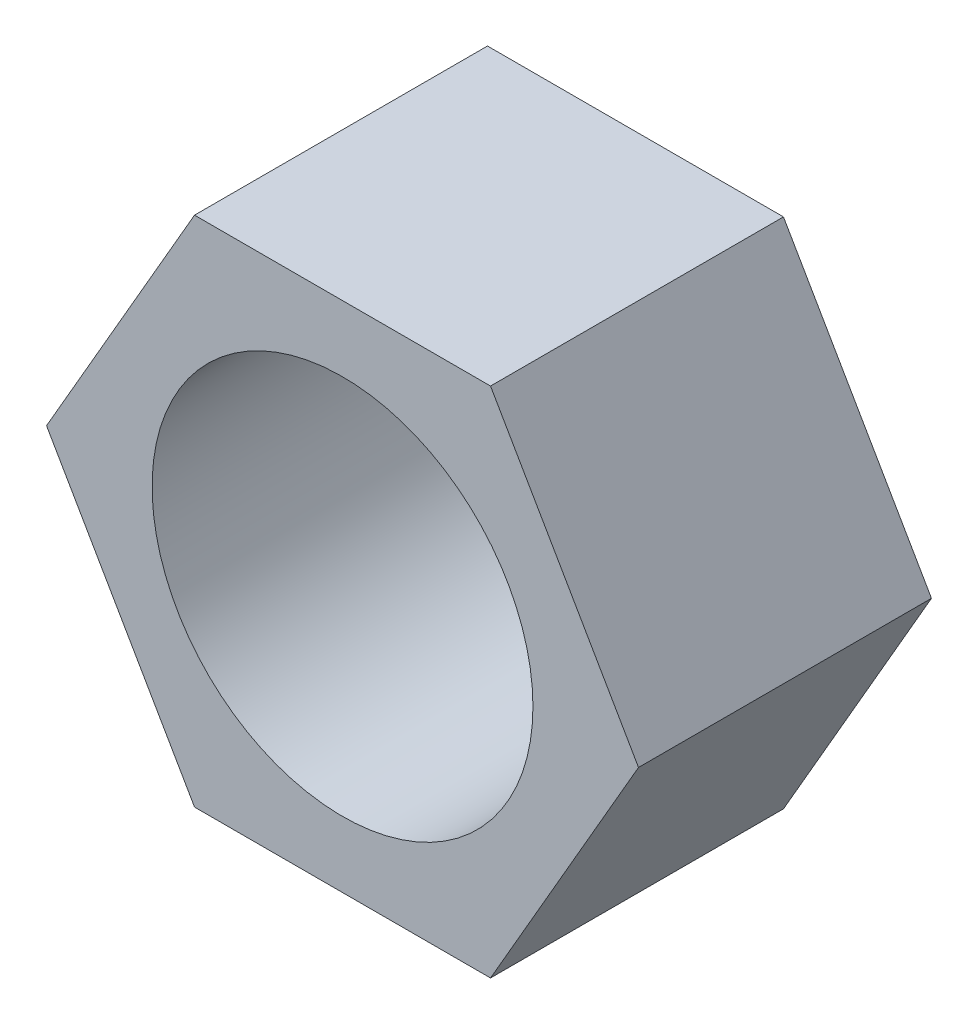
ISO-10303-21;
HEADER;
FILE_DESCRIPTION(('STEP AP214'),'2;1');
FILE_NAME('part.step','',(''),(''),'','','');
FILE_SCHEMA(('AUTOMOTIVE_DESIGN { 1 0 10303 214 1 1 1 1 }'));
ENDSEC;
DATA;
#1=APPLICATION_CONTEXT('core data for automotive mechanical design processes');
#2=APPLICATION_PROTOCOL_DEFINITION('international standard','automotive_design',2000,#1);
#3=PRODUCT_CONTEXT('',#1,'mechanical');
#4=PRODUCT('Part','Part','',(#3));
#5=PRODUCT_RELATED_PRODUCT_CATEGORY('part','',(#4));
#6=PRODUCT_DEFINITION_FORMATION('','',#4);
#7=PRODUCT_DEFINITION_CONTEXT('part definition',#1,'design');
#8=PRODUCT_DEFINITION('design','',#6,#7);
#9=PRODUCT_DEFINITION_SHAPE('','',#8);
#10=(LENGTH_UNIT() NAMED_UNIT(*) SI_UNIT(.MILLI.,.METRE.));
#11=(NAMED_UNIT(*) PLANE_ANGLE_UNIT() SI_UNIT($,.RADIAN.));
#12=(NAMED_UNIT(*) SI_UNIT($,.STERADIAN.) SOLID_ANGLE_UNIT());
#13=UNCERTAINTY_MEASURE_WITH_UNIT(LENGTH_MEASURE(1.E-05),#10,'distance_accuracy_value','');
#14=(GEOMETRIC_REPRESENTATION_CONTEXT(3) GLOBAL_UNCERTAINTY_ASSIGNED_CONTEXT((#13)) GLOBAL_UNIT_ASSIGNED_CONTEXT((#10,
#11,#12)) REPRESENTATION_CONTEXT('',''));
#15=CARTESIAN_POINT('',(0.,0.,0.));
#16=DIRECTION('',(0.,0.,1.));
#17=DIRECTION('',(1.,0.,0.));
#18=AXIS2_PLACEMENT_3D('',#15,#16,#17);
#19=CARTESIAN_POINT('',(0.,0.,0.2));
#20=DIRECTION('',(0.,0.,1.));
#21=DIRECTION('',(1.,0.,0.));
#22=AXIS2_PLACEMENT_3D('',#19,#20,#21);
#23=PLANE('',#22);
#24=DIRECTION('',(1.,0.,0.));
#25=VECTOR('',#24,1.);
#26=CARTESIAN_POINT('',(-0.101036297108184,-0.175,0.2));
#27=LINE('',#26,#25);
#28=CARTESIAN_POINT('',(-0.101036297108184,-0.175,0.2));
#29=VERTEX_POINT('',#28);
#30=CARTESIAN_POINT('',(0.101036297108184,-0.175,0.2));
#31=VERTEX_POINT('',#30);
#32=EDGE_CURVE('E129',#29,#31,#27,.T.);
#33=ORIENTED_EDGE('',*,*,#32,.T.);
#34=DIRECTION('',(0.5,0.866025403784439,0.));
#35=VECTOR('',#34,1.);
#36=CARTESIAN_POINT('',(0.101036297108184,-0.175,0.2));
#37=LINE('',#36,#35);
#38=CARTESIAN_POINT('',(0.202072594216369,0.,0.2));
#39=VERTEX_POINT('',#38);
#40=EDGE_CURVE('E87',#31,#39,#37,.T.);
#41=ORIENTED_EDGE('',*,*,#40,.T.);
#42=DIRECTION('',(-0.5,0.866025403784438,0.));
#43=VECTOR('',#42,1.);
#44=CARTESIAN_POINT('',(0.202072594216369,0.,0.2));
#45=LINE('',#44,#43);
#46=CARTESIAN_POINT('',(0.101036297108184,0.175,0.2));
#47=VERTEX_POINT('',#46);
#48=EDGE_CURVE('E100',#39,#47,#45,.T.);
#49=ORIENTED_EDGE('',*,*,#48,.T.);
#50=DIRECTION('',(-1.,0.,0.));
#51=VECTOR('',#50,1.);
#52=CARTESIAN_POINT('',(0.101036297108184,0.175,0.2));
#53=LINE('',#52,#51);
#54=CARTESIAN_POINT('',(-0.101036297108185,0.175,0.2));
#55=VERTEX_POINT('',#54);
#56=EDGE_CURVE('E94',#47,#55,#53,.T.);
#57=ORIENTED_EDGE('',*,*,#56,.T.);
#58=DIRECTION('',(-0.5,-0.866025403784439,0.));
#59=VECTOR('',#58,1.);
#60=CARTESIAN_POINT('',(-0.101036297108185,0.175,0.2));
#61=LINE('',#60,#59);
#62=CARTESIAN_POINT('',(-0.202072594216369,0.,0.2));
#63=VERTEX_POINT('',#62);
#64=EDGE_CURVE('E98',#55,#63,#61,.T.);
#65=ORIENTED_EDGE('',*,*,#64,.T.);
#66=DIRECTION('',(0.5,-0.866025403784439,0.));
#67=VECTOR('',#66,1.);
#68=CARTESIAN_POINT('',(-0.202072594216369,0.,0.2));
#69=LINE('',#68,#67);
#70=EDGE_CURVE('E50',#63,#29,#69,.T.);
#71=ORIENTED_EDGE('',*,*,#70,.T.);
#72=EDGE_LOOP('',(#33,#41,#49,#57,#65,#71));
#73=FACE_BOUND('',#72,.T.);
#74=CARTESIAN_POINT('',(0.,0.,0.2));
#75=DIRECTION('',(0.,0.,1.));
#76=DIRECTION('',(1.,0.,0.));
#77=AXIS2_PLACEMENT_3D('',#74,#75,#76);
#78=CIRCLE('',#77,0.13);
#79=CARTESIAN_POINT('',(0.13,0.,0.2));
#80=VERTEX_POINT('',#79);
#81=EDGE_CURVE('E122',#80,#80,#78,.T.);
#82=ORIENTED_EDGE('',*,*,#81,.F.);
#83=EDGE_LOOP('',(#82));
#84=FACE_BOUND('',#83,.T.);
#85=ADVANCED_FACE('F33',(#73,#84),#23,.T.);
#86=CARTESIAN_POINT('',(0.,0.,0.));
#87=DIRECTION('',(0.,0.,1.));
#88=DIRECTION('',(1.,0.,0.));
#89=AXIS2_PLACEMENT_3D('',#86,#87,#88);
#90=PLANE('',#89);
#91=DIRECTION('',(1.,0.,0.));
#92=VECTOR('',#91,1.);
#93=CARTESIAN_POINT('',(-0.101036297108184,-0.175,0.));
#94=LINE('',#93,#92);
#95=CARTESIAN_POINT('',(-0.101036297108184,-0.175,0.));
#96=VERTEX_POINT('',#95);
#97=CARTESIAN_POINT('',(0.101036297108184,-0.175,0.));
#98=VERTEX_POINT('',#97);
#99=EDGE_CURVE('E118',#96,#98,#94,.T.);
#100=ORIENTED_EDGE('',*,*,#99,.F.);
#101=DIRECTION('',(0.5,-0.866025403784439,0.));
#102=VECTOR('',#101,1.);
#103=CARTESIAN_POINT('',(-0.202072594216369,0.,0.));
#104=LINE('',#103,#102);
#105=CARTESIAN_POINT('',(-0.202072594216369,0.,0.));
#106=VERTEX_POINT('',#105);
#107=EDGE_CURVE('E79',#106,#96,#104,.T.);
#108=ORIENTED_EDGE('',*,*,#107,.F.);
#109=DIRECTION('',(-0.5,-0.866025403784439,0.));
#110=VECTOR('',#109,1.);
#111=CARTESIAN_POINT('',(-0.101036297108185,0.175,0.));
#112=LINE('',#111,#110);
#113=CARTESIAN_POINT('',(-0.101036297108185,0.175,0.));
#114=VERTEX_POINT('',#113);
#115=EDGE_CURVE('E73',#114,#106,#112,.T.);
#116=ORIENTED_EDGE('',*,*,#115,.F.);
#117=DIRECTION('',(-1.,0.,0.));
#118=VECTOR('',#117,1.);
#119=CARTESIAN_POINT('',(0.101036297108184,0.175,0.));
#120=LINE('',#119,#118);
#121=CARTESIAN_POINT('',(0.101036297108184,0.175,0.));
#122=VERTEX_POINT('',#121);
#123=EDGE_CURVE('E108',#122,#114,#120,.T.);
#124=ORIENTED_EDGE('',*,*,#123,.F.);
#125=DIRECTION('',(-0.5,0.866025403784438,0.));
#126=VECTOR('',#125,1.);
#127=CARTESIAN_POINT('',(0.202072594216369,0.,0.));
#128=LINE('',#127,#126);
#129=CARTESIAN_POINT('',(0.202072594216369,0.,0.));
#130=VERTEX_POINT('',#129);
#131=EDGE_CURVE('E124',#130,#122,#128,.T.);
#132=ORIENTED_EDGE('',*,*,#131,.F.);
#133=DIRECTION('',(0.5,0.866025403784439,0.));
#134=VECTOR('',#133,1.);
#135=CARTESIAN_POINT('',(0.101036297108184,-0.175,0.));
#136=LINE('',#135,#134);
#137=EDGE_CURVE('E121',#98,#130,#136,.T.);
#138=ORIENTED_EDGE('',*,*,#137,.F.);
#139=EDGE_LOOP('',(#100,#108,#116,#124,#132,#138));
#140=FACE_BOUND('',#139,.T.);
#141=CARTESIAN_POINT('',(0.,0.,0.));
#142=DIRECTION('',(0.,0.,1.));
#143=DIRECTION('',(1.,0.,0.));
#144=AXIS2_PLACEMENT_3D('',#141,#142,#143);
#145=CIRCLE('',#144,0.13);
#146=CARTESIAN_POINT('',(0.13,0.,0.));
#147=VERTEX_POINT('',#146);
#148=EDGE_CURVE('E222',#147,#147,#145,.T.);
#149=ORIENTED_EDGE('',*,*,#148,.T.);
#150=EDGE_LOOP('',(#149));
#151=FACE_BOUND('',#150,.T.);
#152=ADVANCED_FACE('F138',(#140,#151),#90,.F.);
#153=CARTESIAN_POINT('',(-0.101036297108184,-0.175,0.2));
#154=DIRECTION('',(0.,1.,0.));
#155=DIRECTION('',(0.,0.,1.));
#156=AXIS2_PLACEMENT_3D('',#153,#154,#155);
#157=PLANE('',#156);
#158=ORIENTED_EDGE('',*,*,#99,.T.);
#159=DIRECTION('',(0.,0.,-1.));
#160=VECTOR('',#159,1.);
#161=CARTESIAN_POINT('',(0.101036297108184,-0.175,0.2));
#162=LINE('',#161,#160);
#163=EDGE_CURVE('E11',#31,#98,#162,.T.);
#164=ORIENTED_EDGE('',*,*,#163,.F.);
#165=ORIENTED_EDGE('',*,*,#32,.F.);
#166=DIRECTION('',(0.,0.,-1.));
#167=VECTOR('',#166,1.);
#168=CARTESIAN_POINT('',(-0.101036297108184,-0.175,0.2));
#169=LINE('',#168,#167);
#170=EDGE_CURVE('E114',#29,#96,#169,.T.);
#171=ORIENTED_EDGE('',*,*,#170,.T.);
#172=EDGE_LOOP('',(#158,#164,#165,#171));
#173=FACE_BOUND('',#172,.T.);
#174=ADVANCED_FACE('F35',(#173),#157,.F.);
#175=CARTESIAN_POINT('',(0.101036297108184,-0.175,0.2));
#176=DIRECTION('',(-0.866025403784439,0.5,0.));
#177=DIRECTION('',(-0.5,-0.866025403784439,0.));
#178=AXIS2_PLACEMENT_3D('',#175,#176,#177);
#179=PLANE('',#178);
#180=ORIENTED_EDGE('',*,*,#137,.T.);
#181=DIRECTION('',(0.,0.,-1.));
#182=VECTOR('',#181,1.);
#183=CARTESIAN_POINT('',(0.202072594216369,0.,0.2));
#184=LINE('',#183,#182);
#185=EDGE_CURVE('E42',#39,#130,#184,.T.);
#186=ORIENTED_EDGE('',*,*,#185,.F.);
#187=ORIENTED_EDGE('',*,*,#40,.F.);
#188=ORIENTED_EDGE('',*,*,#163,.T.);
#189=EDGE_LOOP('',(#180,#186,#187,#188));
#190=FACE_BOUND('',#189,.T.);
#191=ADVANCED_FACE('F163',(#190),#179,.F.);
#192=CARTESIAN_POINT('',(0.202072594216369,0.,0.2));
#193=DIRECTION('',(-0.866025403784438,-0.5,0.));
#194=DIRECTION('',(0.5,-0.866025403784439,0.));
#195=AXIS2_PLACEMENT_3D('',#192,#193,#194);
#196=PLANE('',#195);
#197=ORIENTED_EDGE('',*,*,#131,.T.);
#198=DIRECTION('',(0.,0.,-1.));
#199=VECTOR('',#198,1.);
#200=CARTESIAN_POINT('',(0.101036297108184,0.175,0.2));
#201=LINE('',#200,#199);
#202=EDGE_CURVE('E109',#47,#122,#201,.T.);
#203=ORIENTED_EDGE('',*,*,#202,.F.);
#204=ORIENTED_EDGE('',*,*,#48,.F.);
#205=ORIENTED_EDGE('',*,*,#185,.T.);
#206=EDGE_LOOP('',(#197,#203,#204,#205));
#207=FACE_BOUND('',#206,.T.);
#208=ADVANCED_FACE('F135',(#207),#196,.F.);
#209=CARTESIAN_POINT('',(0.101036297108184,0.175,0.2));
#210=DIRECTION('',(0.,-1.,0.));
#211=DIRECTION('',(0.,0.,-1.));
#212=AXIS2_PLACEMENT_3D('',#209,#210,#211);
#213=PLANE('',#212);
#214=ORIENTED_EDGE('',*,*,#123,.T.);
#215=DIRECTION('',(0.,0.,-1.));
#216=VECTOR('',#215,1.);
#217=CARTESIAN_POINT('',(-0.101036297108185,0.175,0.2));
#218=LINE('',#217,#216);
#219=EDGE_CURVE('E105',#55,#114,#218,.T.);
#220=ORIENTED_EDGE('',*,*,#219,.F.);
#221=ORIENTED_EDGE('',*,*,#56,.F.);
#222=ORIENTED_EDGE('',*,*,#202,.T.);
#223=EDGE_LOOP('',(#214,#220,#221,#222));
#224=FACE_BOUND('',#223,.T.);
#225=ADVANCED_FACE('F106',(#224),#213,.F.);
#226=CARTESIAN_POINT('',(-0.101036297108185,0.175,0.2));
#227=DIRECTION('',(0.866025403784439,-0.5,0.));
#228=DIRECTION('',(0.5,0.866025403784439,0.));
#229=AXIS2_PLACEMENT_3D('',#226,#227,#228);
#230=PLANE('',#229);
#231=ORIENTED_EDGE('',*,*,#115,.T.);
#232=DIRECTION('',(0.,0.,-1.));
#233=VECTOR('',#232,1.);
#234=CARTESIAN_POINT('',(-0.202072594216369,0.,0.2));
#235=LINE('',#234,#233);
#236=EDGE_CURVE('E110',#63,#106,#235,.T.);
#237=ORIENTED_EDGE('',*,*,#236,.F.);
#238=ORIENTED_EDGE('',*,*,#64,.F.);
#239=ORIENTED_EDGE('',*,*,#219,.T.);
#240=EDGE_LOOP('',(#231,#237,#238,#239));
#241=FACE_BOUND('',#240,.T.);
#242=ADVANCED_FACE('F112',(#241),#230,.F.);
#243=CARTESIAN_POINT('',(-0.202072594216369,0.,0.2));
#244=DIRECTION('',(0.866025403784439,0.5,0.));
#245=DIRECTION('',(-0.5,0.866025403784439,0.));
#246=AXIS2_PLACEMENT_3D('',#243,#244,#245);
#247=PLANE('',#246);
#248=ORIENTED_EDGE('',*,*,#107,.T.);
#249=ORIENTED_EDGE('',*,*,#170,.F.);
#250=ORIENTED_EDGE('',*,*,#70,.F.);
#251=ORIENTED_EDGE('',*,*,#236,.T.);
#252=EDGE_LOOP('',(#248,#249,#250,#251));
#253=FACE_BOUND('',#252,.T.);
#254=ADVANCED_FACE('F143',(#253),#247,.F.);
#255=CARTESIAN_POINT('',(0.,0.,0.2));
#256=DIRECTION('',(0.,0.,-1.));
#257=DIRECTION('',(-1.,0.,0.));
#258=AXIS2_PLACEMENT_3D('',#255,#256,#257);
#259=CYLINDRICAL_SURFACE('',#258,0.13);
#260=ORIENTED_EDGE('',*,*,#81,.T.);
#261=EDGE_LOOP('',(#260));
#262=FACE_BOUND('',#261,.T.);
#263=ORIENTED_EDGE('',*,*,#148,.F.);
#264=EDGE_LOOP('',(#263));
#265=FACE_BOUND('',#264,.T.);
#266=ADVANCED_FACE('F145',(#262,#265),#259,.F.);
#267=CLOSED_SHELL('',(#85,#152,#174,#191,#208,#225,#242,#254,#266));
#268=MANIFOLD_SOLID_BREP('B2',#267);
#269=ADVANCED_BREP_SHAPE_REPRESENTATION('',(#18,#268),#14);
#270=SHAPE_DEFINITION_REPRESENTATION(#9,#269);
ENDSEC;
END-ISO-10303-21;
